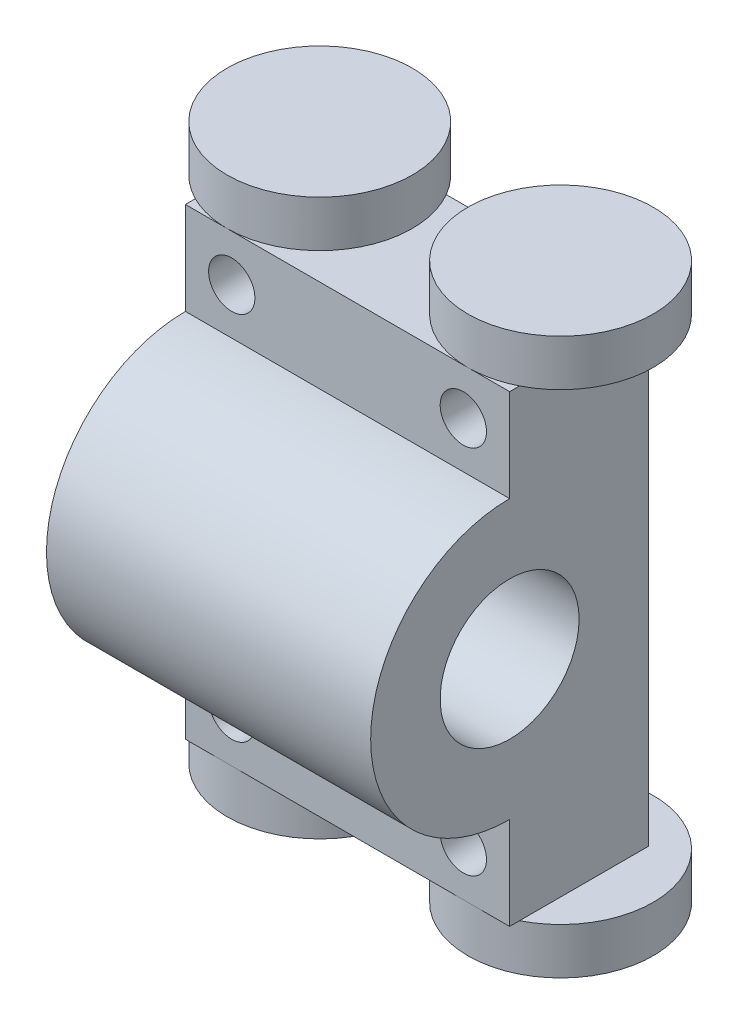
ISO-10303-21;
HEADER;
FILE_DESCRIPTION(('STEP AP214'),'2;1');
FILE_NAME('part.step','',(''),(''),'','','');
FILE_SCHEMA(('AUTOMOTIVE_DESIGN { 1 0 10303 214 1 1 1 1 }'));
ENDSEC;
DATA;
#1=APPLICATION_CONTEXT('core data for automotive mechanical design processes');
#2=APPLICATION_PROTOCOL_DEFINITION('international standard','automotive_design',2000,#1);
#3=PRODUCT_CONTEXT('',#1,'mechanical');
#4=PRODUCT('Part','Part','',(#3));
#5=PRODUCT_RELATED_PRODUCT_CATEGORY('part','',(#4));
#6=PRODUCT_DEFINITION_FORMATION('','',#4);
#7=PRODUCT_DEFINITION_CONTEXT('part definition',#1,'design');
#8=PRODUCT_DEFINITION('design','',#6,#7);
#9=PRODUCT_DEFINITION_SHAPE('','',#8);
#10=(LENGTH_UNIT() NAMED_UNIT(*) SI_UNIT(.MILLI.,.METRE.));
#11=(NAMED_UNIT(*) PLANE_ANGLE_UNIT() SI_UNIT($,.RADIAN.));
#12=(NAMED_UNIT(*) SI_UNIT($,.STERADIAN.) SOLID_ANGLE_UNIT());
#13=UNCERTAINTY_MEASURE_WITH_UNIT(LENGTH_MEASURE(1.E-05),#10,'distance_accuracy_value','');
#14=(GEOMETRIC_REPRESENTATION_CONTEXT(3) GLOBAL_UNCERTAINTY_ASSIGNED_CONTEXT((#13)) GLOBAL_UNIT_ASSIGNED_CONTEXT((#10,
#11,#12)) REPRESENTATION_CONTEXT('',''));
#15=CARTESIAN_POINT('',(0.,0.,0.));
#16=DIRECTION('',(0.,0.,1.));
#17=DIRECTION('',(1.,0.,0.));
#18=AXIS2_PLACEMENT_3D('',#15,#16,#17);
#19=CARTESIAN_POINT('',(35.,-25.,15.));
#20=DIRECTION('',(0.,1.,0.));
#21=DIRECTION('',(0.,0.,1.));
#22=AXIS2_PLACEMENT_3D('',#19,#20,#21);
#23=PLANE('',#22);
#24=DIRECTION('',(-1.,0.,0.));
#25=VECTOR('',#24,1.);
#26=CARTESIAN_POINT('',(35.,-25.,15.));
#27=LINE('',#26,#25);
#28=CARTESIAN_POINT('',(35.,-25.,15.));
#29=VERTEX_POINT('',#28);
#30=CARTESIAN_POINT('',(30.5,-25.,15.));
#31=VERTEX_POINT('',#30);
#32=EDGE_CURVE('E41',#29,#31,#27,.T.);
#33=ORIENTED_EDGE('',*,*,#32,.T.);
#34=CARTESIAN_POINT('',(30.5,-25.,5.));
#35=DIRECTION('',(0.,-1.,0.));
#36=DIRECTION('',(0.,0.,1.));
#37=AXIS2_PLACEMENT_3D('',#34,#35,#36);
#38=CIRCLE('',#37,10.);
#39=CARTESIAN_POINT('',(35.,-25.,13.9302855497459));
#40=VERTEX_POINT('',#39);
#41=EDGE_CURVE('E126',#40,#31,#38,.T.);
#42=ORIENTED_EDGE('',*,*,#41,.F.);
#43=DIRECTION('',(0.,0.,-1.));
#44=VECTOR('',#43,1.);
#45=CARTESIAN_POINT('',(35.,-25.,15.));
#46=LINE('',#45,#44);
#47=EDGE_CURVE('E150',#29,#40,#46,.T.);
#48=ORIENTED_EDGE('',*,*,#47,.F.);
#49=EDGE_LOOP('',(#33,#42,#48));
#50=FACE_BOUND('',#49,.T.);
#51=ADVANCED_FACE('F32',(#50),#23,.F.);
#52=CARTESIAN_POINT('',(35.,25.,15.));
#53=DIRECTION('',(0.,-1.,0.));
#54=DIRECTION('',(0.,0.,-1.));
#55=AXIS2_PLACEMENT_3D('',#52,#53,#54);
#56=PLANE('',#55);
#57=CARTESIAN_POINT('',(30.5,25.,5.));
#58=DIRECTION('',(0.,-1.,0.));
#59=DIRECTION('',(0.,0.,1.));
#60=AXIS2_PLACEMENT_3D('',#57,#58,#59);
#61=CIRCLE('',#60,10.);
#62=CARTESIAN_POINT('',(30.5,25.,15.));
#63=VERTEX_POINT('',#62);
#64=CARTESIAN_POINT('',(21.8397459621556,25.,0.));
#65=VERTEX_POINT('',#64);
#66=EDGE_CURVE('E225',#63,#65,#61,.T.);
#67=ORIENTED_EDGE('',*,*,#66,.T.);
#68=DIRECTION('',(-1.,0.,0.));
#69=VECTOR('',#68,1.);
#70=CARTESIAN_POINT('',(35.,25.,0.));
#71=LINE('',#70,#69);
#72=CARTESIAN_POINT('',(13.1602540378444,25.,0.));
#73=VERTEX_POINT('',#72);
#74=EDGE_CURVE('E160',#65,#73,#71,.T.);
#75=ORIENTED_EDGE('',*,*,#74,.T.);
#76=CARTESIAN_POINT('',(4.5,25.,5.));
#77=DIRECTION('',(0.,1.,0.));
#78=DIRECTION('',(0.,0.,1.));
#79=AXIS2_PLACEMENT_3D('',#76,#77,#78);
#80=CIRCLE('',#79,10.);
#81=CARTESIAN_POINT('',(4.5,25.,15.));
#82=VERTEX_POINT('',#81);
#83=EDGE_CURVE('E206',#82,#73,#80,.T.);
#84=ORIENTED_EDGE('',*,*,#83,.F.);
#85=DIRECTION('',(-1.,0.,0.));
#86=VECTOR('',#85,1.);
#87=CARTESIAN_POINT('',(35.,25.,15.));
#88=LINE('',#87,#86);
#89=EDGE_CURVE('E164',#63,#82,#88,.T.);
#90=ORIENTED_EDGE('',*,*,#89,.F.);
#91=EDGE_LOOP('',(#67,#75,#84,#90));
#92=FACE_BOUND('',#91,.T.);
#93=ADVANCED_FACE('F291',(#92),#56,.F.);
#94=CARTESIAN_POINT('',(4.5,-25.,5.));
#95=DIRECTION('',(0.,1.,0.));
#96=DIRECTION('',(0.,0.,1.));
#97=AXIS2_PLACEMENT_3D('',#94,#95,#96);
#98=CIRCLE('',#97,10.);
#99=CARTESIAN_POINT('',(0.,-25.,13.9302855497459));
#100=VERTEX_POINT('',#99);
#101=CARTESIAN_POINT('',(4.5,-25.,15.));
#102=VERTEX_POINT('',#101);
#103=EDGE_CURVE('E224',#100,#102,#98,.T.);
#104=ORIENTED_EDGE('',*,*,#103,.T.);
#105=CARTESIAN_POINT('',(0.,-25.,15.));
#106=VERTEX_POINT('',#105);
#107=EDGE_CURVE('E147',#102,#106,#27,.T.);
#108=ORIENTED_EDGE('',*,*,#107,.T.);
#109=DIRECTION('',(0.,0.,-1.));
#110=VECTOR('',#109,1.);
#111=CARTESIAN_POINT('',(0.,-25.,15.));
#112=LINE('',#111,#110);
#113=EDGE_CURVE('E179',#106,#100,#112,.T.);
#114=ORIENTED_EDGE('',*,*,#113,.T.);
#115=EDGE_LOOP('',(#104,#108,#114));
#116=FACE_BOUND('',#115,.T.);
#117=ADVANCED_FACE('F313',(#116),#23,.F.);
#118=CARTESIAN_POINT('',(35.,25.,13.9302855497459));
#119=VERTEX_POINT('',#118);
#120=EDGE_CURVE('E231',#119,#63,#61,.T.);
#121=ORIENTED_EDGE('',*,*,#120,.T.);
#122=CARTESIAN_POINT('',(35.,25.,15.));
#123=VERTEX_POINT('',#122);
#124=EDGE_CURVE('E161',#123,#63,#88,.T.);
#125=ORIENTED_EDGE('',*,*,#124,.F.);
#126=DIRECTION('',(0.,0.,1.));
#127=VECTOR('',#126,1.);
#128=CARTESIAN_POINT('',(35.,25.,15.));
#129=LINE('',#128,#127);
#130=EDGE_CURVE('E191',#119,#123,#129,.T.);
#131=ORIENTED_EDGE('',*,*,#130,.F.);
#132=EDGE_LOOP('',(#121,#125,#131));
#133=FACE_BOUND('',#132,.T.);
#134=ADVANCED_FACE('F288',(#133),#56,.F.);
#135=CARTESIAN_POINT('',(35.,0.,15.));
#136=DIRECTION('',(-1.,0.,0.));
#137=DIRECTION('',(0.,0.,1.));
#138=AXIS2_PLACEMENT_3D('',#135,#136,#137);
#139=CYLINDRICAL_SURFACE('',#138,15.);
#140=CARTESIAN_POINT('',(0.,0.,15.));
#141=DIRECTION('',(1.,0.,0.));
#142=DIRECTION('',(0.,0.,-1.));
#143=AXIS2_PLACEMENT_3D('',#140,#141,#142);
#144=CIRCLE('',#143,15.);
#145=CARTESIAN_POINT('',(0.,15.,15.));
#146=VERTEX_POINT('',#145);
#147=CARTESIAN_POINT('',(0.,-15.,15.));
#148=VERTEX_POINT('',#147);
#149=EDGE_CURVE('E183',#146,#148,#144,.T.);
#150=ORIENTED_EDGE('',*,*,#149,.T.);
#151=DIRECTION('',(-1.,0.,0.));
#152=VECTOR('',#151,1.);
#153=CARTESIAN_POINT('',(35.,-15.,15.));
#154=LINE('',#153,#152);
#155=CARTESIAN_POINT('',(35.,-15.,15.));
#156=VERTEX_POINT('',#155);
#157=EDGE_CURVE('E11',#156,#148,#154,.T.);
#158=ORIENTED_EDGE('',*,*,#157,.F.);
#159=CARTESIAN_POINT('',(35.,0.,15.));
#160=DIRECTION('',(1.,0.,0.));
#161=DIRECTION('',(0.,0.,-1.));
#162=AXIS2_PLACEMENT_3D('',#159,#160,#161);
#163=CIRCLE('',#162,15.);
#164=CARTESIAN_POINT('',(35.,15.,15.));
#165=VERTEX_POINT('',#164);
#166=EDGE_CURVE('E172',#165,#156,#163,.T.);
#167=ORIENTED_EDGE('',*,*,#166,.F.);
#168=DIRECTION('',(-1.,0.,0.));
#169=VECTOR('',#168,1.);
#170=CARTESIAN_POINT('',(35.,15.,15.));
#171=LINE('',#170,#169);
#172=EDGE_CURVE('E166',#165,#146,#171,.T.);
#173=ORIENTED_EDGE('',*,*,#172,.T.);
#174=EDGE_LOOP('',(#150,#158,#167,#173));
#175=FACE_BOUND('',#174,.T.);
#176=ADVANCED_FACE('F34',(#175),#139,.T.);
#177=CARTESIAN_POINT('',(35.,-15.,15.));
#178=DIRECTION('',(0.,0.,-1.));
#179=DIRECTION('',(0.,1.,0.));
#180=AXIS2_PLACEMENT_3D('',#177,#178,#179);
#181=PLANE('',#180);
#182=CARTESIAN_POINT('',(5.,-20.,15.));
#183=DIRECTION('',(0.,0.,1.));
#184=DIRECTION('',(-1.,0.,0.));
#185=AXIS2_PLACEMENT_3D('',#182,#183,#184);
#186=CIRCLE('',#185,2.5);
#187=CARTESIAN_POINT('',(2.5,-20.,15.));
#188=VERTEX_POINT('',#187);
#189=EDGE_CURVE('E249',#188,#188,#186,.T.);
#190=ORIENTED_EDGE('',*,*,#189,.F.);
#191=EDGE_LOOP('',(#190));
#192=FACE_BOUND('',#191,.T.);
#193=CARTESIAN_POINT('',(30.,-20.,15.));
#194=DIRECTION('',(0.,0.,1.));
#195=DIRECTION('',(1.,0.,0.));
#196=AXIS2_PLACEMENT_3D('',#193,#194,#195);
#197=CIRCLE('',#196,2.5);
#198=CARTESIAN_POINT('',(32.5,-20.,15.));
#199=VERTEX_POINT('',#198);
#200=EDGE_CURVE('E252',#199,#199,#197,.T.);
#201=ORIENTED_EDGE('',*,*,#200,.F.);
#202=EDGE_LOOP('',(#201));
#203=FACE_BOUND('',#202,.T.);
#204=DIRECTION('',(0.,-1.,0.));
#205=VECTOR('',#204,1.);
#206=CARTESIAN_POINT('',(0.,-15.,15.));
#207=LINE('',#206,#205);
#208=EDGE_CURVE('E181',#148,#106,#207,.T.);
#209=ORIENTED_EDGE('',*,*,#208,.T.);
#210=ORIENTED_EDGE('',*,*,#107,.F.);
#211=EDGE_CURVE('E57',#31,#102,#27,.T.);
#212=ORIENTED_EDGE('',*,*,#211,.F.);
#213=ORIENTED_EDGE('',*,*,#32,.F.);
#214=DIRECTION('',(0.,-1.,0.));
#215=VECTOR('',#214,1.);
#216=CARTESIAN_POINT('',(35.,-15.,15.));
#217=LINE('',#216,#215);
#218=EDGE_CURVE('E196',#156,#29,#217,.T.);
#219=ORIENTED_EDGE('',*,*,#218,.F.);
#220=ORIENTED_EDGE('',*,*,#157,.T.);
#221=EDGE_LOOP('',(#209,#210,#212,#213,#219,#220));
#222=FACE_BOUND('',#221,.T.);
#223=ADVANCED_FACE('F146',(#192,#203,#222),#181,.F.);
#224=DIRECTION('',(-1.,0.,0.));
#225=VECTOR('',#224,1.);
#226=CARTESIAN_POINT('',(35.,-25.,0.));
#227=LINE('',#226,#225);
#228=CARTESIAN_POINT('',(21.8397459621556,-25.,0.));
#229=VERTEX_POINT('',#228);
#230=CARTESIAN_POINT('',(13.1602540378444,-25.,0.));
#231=VERTEX_POINT('',#230);
#232=EDGE_CURVE('E139',#229,#231,#227,.T.);
#233=ORIENTED_EDGE('',*,*,#232,.F.);
#234=EDGE_CURVE('E129',#31,#229,#38,.T.);
#235=ORIENTED_EDGE('',*,*,#234,.F.);
#236=ORIENTED_EDGE('',*,*,#211,.T.);
#237=EDGE_CURVE('E220',#102,#231,#98,.T.);
#238=ORIENTED_EDGE('',*,*,#237,.T.);
#239=EDGE_LOOP('',(#233,#235,#236,#238));
#240=FACE_BOUND('',#239,.T.);
#241=ADVANCED_FACE('F138',(#240),#23,.F.);
#242=CARTESIAN_POINT('',(35.,25.,0.));
#243=DIRECTION('',(0.,0.,1.));
#244=DIRECTION('',(1.,0.,0.));
#245=AXIS2_PLACEMENT_3D('',#242,#243,#244);
#246=PLANE('',#245);
#247=CARTESIAN_POINT('',(5.,-20.,0.));
#248=DIRECTION('',(0.,0.,1.));
#249=DIRECTION('',(1.,0.,0.));
#250=AXIS2_PLACEMENT_3D('',#247,#248,#249);
#251=CIRCLE('',#250,2.5);
#252=CARTESIAN_POINT('',(7.5,-20.,0.));
#253=VERTEX_POINT('',#252);
#254=EDGE_CURVE('E36',#253,#253,#251,.T.);
#255=ORIENTED_EDGE('',*,*,#254,.T.);
#256=EDGE_LOOP('',(#255));
#257=FACE_BOUND('',#256,.T.);
#258=CARTESIAN_POINT('',(30.,-20.,0.));
#259=DIRECTION('',(0.,0.,1.));
#260=DIRECTION('',(1.,0.,0.));
#261=AXIS2_PLACEMENT_3D('',#258,#259,#260);
#262=CIRCLE('',#261,2.5);
#263=CARTESIAN_POINT('',(32.5,-20.,0.));
#264=VERTEX_POINT('',#263);
#265=EDGE_CURVE('E241',#264,#264,#262,.T.);
#266=ORIENTED_EDGE('',*,*,#265,.T.);
#267=EDGE_LOOP('',(#266));
#268=FACE_BOUND('',#267,.T.);
#269=CARTESIAN_POINT('',(30.,20.,0.));
#270=DIRECTION('',(0.,0.,1.));
#271=DIRECTION('',(1.,0.,0.));
#272=AXIS2_PLACEMENT_3D('',#269,#270,#271);
#273=CIRCLE('',#272,2.5);
#274=CARTESIAN_POINT('',(32.5,20.,0.));
#275=VERTEX_POINT('',#274);
#276=EDGE_CURVE('E238',#275,#275,#273,.T.);
#277=ORIENTED_EDGE('',*,*,#276,.T.);
#278=EDGE_LOOP('',(#277));
#279=FACE_BOUND('',#278,.T.);
#280=CARTESIAN_POINT('',(5.,20.,0.));
#281=DIRECTION('',(0.,0.,1.));
#282=DIRECTION('',(1.,0.,0.));
#283=AXIS2_PLACEMENT_3D('',#280,#281,#282);
#284=CIRCLE('',#283,2.5);
#285=CARTESIAN_POINT('',(7.5,20.,0.));
#286=VERTEX_POINT('',#285);
#287=EDGE_CURVE('E242',#286,#286,#284,.T.);
#288=ORIENTED_EDGE('',*,*,#287,.T.);
#289=EDGE_LOOP('',(#288));
#290=FACE_BOUND('',#289,.T.);
#291=DIRECTION('',(0.,1.,0.));
#292=VECTOR('',#291,1.);
#293=CARTESIAN_POINT('',(0.,25.,0.));
#294=LINE('',#293,#292);
#295=CARTESIAN_POINT('',(0.,-25.,0.));
#296=VERTEX_POINT('',#295);
#297=CARTESIAN_POINT('',(0.,25.,0.));
#298=VERTEX_POINT('',#297);
#299=EDGE_CURVE('E177',#296,#298,#294,.T.);
#300=ORIENTED_EDGE('',*,*,#299,.T.);
#301=DIRECTION('',(-1.,0.,0.));
#302=VECTOR('',#301,1.);
#303=CARTESIAN_POINT('',(35.,25.,0.));
#304=LINE('',#303,#302);
#305=EDGE_CURVE('E203',#73,#298,#304,.T.);
#306=ORIENTED_EDGE('',*,*,#305,.F.);
#307=ORIENTED_EDGE('',*,*,#74,.F.);
#308=CARTESIAN_POINT('',(35.,25.,0.));
#309=VERTEX_POINT('',#308);
#310=EDGE_CURVE('E157',#309,#65,#71,.T.);
#311=ORIENTED_EDGE('',*,*,#310,.F.);
#312=DIRECTION('',(0.,1.,0.));
#313=VECTOR('',#312,1.);
#314=CARTESIAN_POINT('',(35.,25.,0.));
#315=LINE('',#314,#313);
#316=CARTESIAN_POINT('',(35.,-25.,0.));
#317=VERTEX_POINT('',#316);
#318=EDGE_CURVE('E192',#317,#309,#315,.T.);
#319=ORIENTED_EDGE('',*,*,#318,.F.);
#320=EDGE_CURVE('E152',#317,#229,#227,.T.);
#321=ORIENTED_EDGE('',*,*,#320,.T.);
#322=ORIENTED_EDGE('',*,*,#232,.T.);
#323=DIRECTION('',(1.,0.,0.));
#324=VECTOR('',#323,1.);
#325=CARTESIAN_POINT('',(35.,-25.,0.));
#326=LINE('',#325,#324);
#327=EDGE_CURVE('E211',#296,#231,#326,.T.);
#328=ORIENTED_EDGE('',*,*,#327,.F.);
#329=EDGE_LOOP('',(#300,#306,#307,#311,#319,#321,#322,#328));
#330=FACE_BOUND('',#329,.T.);
#331=ADVANCED_FACE('F306',(#257,#268,#279,#290,#330),#246,.F.);
#332=CARTESIAN_POINT('',(0.,25.,15.));
#333=VERTEX_POINT('',#332);
#334=EDGE_CURVE('E165',#82,#333,#88,.T.);
#335=ORIENTED_EDGE('',*,*,#334,.F.);
#336=CARTESIAN_POINT('',(0.,25.,13.9302855497459));
#337=VERTEX_POINT('',#336);
#338=EDGE_CURVE('E210',#337,#82,#80,.T.);
#339=ORIENTED_EDGE('',*,*,#338,.F.);
#340=DIRECTION('',(0.,0.,1.));
#341=VECTOR('',#340,1.);
#342=CARTESIAN_POINT('',(0.,25.,15.));
#343=LINE('',#342,#341);
#344=EDGE_CURVE('E176',#337,#333,#343,.T.);
#345=ORIENTED_EDGE('',*,*,#344,.T.);
#346=EDGE_LOOP('',(#335,#339,#345));
#347=FACE_BOUND('',#346,.T.);
#348=ADVANCED_FACE('F265',(#347),#56,.F.);
#349=CARTESIAN_POINT('',(35.,25.,15.));
#350=DIRECTION('',(0.,0.,-1.));
#351=DIRECTION('',(0.,1.,0.));
#352=AXIS2_PLACEMENT_3D('',#349,#350,#351);
#353=PLANE('',#352);
#354=CARTESIAN_POINT('',(30.,20.,15.));
#355=DIRECTION('',(0.,0.,1.));
#356=DIRECTION('',(-1.,0.,0.));
#357=AXIS2_PLACEMENT_3D('',#354,#355,#356);
#358=CIRCLE('',#357,2.5);
#359=CARTESIAN_POINT('',(27.5,20.,15.));
#360=VERTEX_POINT('',#359);
#361=EDGE_CURVE('E248',#360,#360,#358,.T.);
#362=ORIENTED_EDGE('',*,*,#361,.F.);
#363=EDGE_LOOP('',(#362));
#364=FACE_BOUND('',#363,.T.);
#365=CARTESIAN_POINT('',(5.,20.,15.));
#366=DIRECTION('',(0.,0.,1.));
#367=DIRECTION('',(1.,0.,0.));
#368=AXIS2_PLACEMENT_3D('',#365,#366,#367);
#369=CIRCLE('',#368,2.5);
#370=CARTESIAN_POINT('',(7.5,20.,15.));
#371=VERTEX_POINT('',#370);
#372=EDGE_CURVE('E245',#371,#371,#369,.T.);
#373=ORIENTED_EDGE('',*,*,#372,.F.);
#374=EDGE_LOOP('',(#373));
#375=FACE_BOUND('',#374,.T.);
#376=DIRECTION('',(0.,-1.,0.));
#377=VECTOR('',#376,1.);
#378=CARTESIAN_POINT('',(0.,25.,15.));
#379=LINE('',#378,#377);
#380=EDGE_CURVE('E170',#333,#146,#379,.T.);
#381=ORIENTED_EDGE('',*,*,#380,.T.);
#382=ORIENTED_EDGE('',*,*,#172,.F.);
#383=DIRECTION('',(0.,-1.,0.));
#384=VECTOR('',#383,1.);
#385=CARTESIAN_POINT('',(35.,25.,15.));
#386=LINE('',#385,#384);
#387=EDGE_CURVE('E169',#123,#165,#386,.T.);
#388=ORIENTED_EDGE('',*,*,#387,.F.);
#389=ORIENTED_EDGE('',*,*,#124,.T.);
#390=ORIENTED_EDGE('',*,*,#89,.T.);
#391=ORIENTED_EDGE('',*,*,#334,.T.);
#392=EDGE_LOOP('',(#381,#382,#388,#389,#390,#391));
#393=FACE_BOUND('',#392,.T.);
#394=ADVANCED_FACE('F261',(#364,#375,#393),#353,.F.);
#395=CARTESIAN_POINT('',(35.,0.,15.));
#396=DIRECTION('',(1.,0.,0.));
#397=DIRECTION('',(0.,0.,-1.));
#398=AXIS2_PLACEMENT_3D('',#395,#396,#397);
#399=PLANE('',#398);
#400=CARTESIAN_POINT('',(35.,0.,15.));
#401=DIRECTION('',(1.,0.,0.));
#402=DIRECTION('',(0.,0.,-1.));
#403=AXIS2_PLACEMENT_3D('',#400,#401,#402);
#404=CIRCLE('',#403,7.5);
#405=CARTESIAN_POINT('',(35.,0.,7.5));
#406=VERTEX_POINT('',#405);
#407=EDGE_CURVE('E200',#406,#406,#404,.T.);
#408=ORIENTED_EDGE('',*,*,#407,.F.);
#409=EDGE_LOOP('',(#408));
#410=FACE_BOUND('',#409,.T.);
#411=ORIENTED_EDGE('',*,*,#166,.T.);
#412=ORIENTED_EDGE('',*,*,#218,.T.);
#413=ORIENTED_EDGE('',*,*,#47,.T.);
#414=DIRECTION('',(0.,0.,-1.));
#415=VECTOR('',#414,1.);
#416=CARTESIAN_POINT('',(35.,-25.,15.));
#417=LINE('',#416,#415);
#418=EDGE_CURVE('E141',#40,#317,#417,.T.);
#419=ORIENTED_EDGE('',*,*,#418,.T.);
#420=ORIENTED_EDGE('',*,*,#318,.T.);
#421=EDGE_CURVE('E188',#309,#119,#129,.T.);
#422=ORIENTED_EDGE('',*,*,#421,.T.);
#423=ORIENTED_EDGE('',*,*,#130,.T.);
#424=ORIENTED_EDGE('',*,*,#387,.T.);
#425=EDGE_LOOP('',(#411,#412,#413,#419,#420,#422,#423,#424));
#426=FACE_BOUND('',#425,.T.);
#427=ADVANCED_FACE('F264',(#410,#426),#399,.T.);
#428=CARTESIAN_POINT('',(0.,0.,15.));
#429=DIRECTION('',(1.,0.,0.));
#430=DIRECTION('',(0.,0.,-1.));
#431=AXIS2_PLACEMENT_3D('',#428,#429,#430);
#432=PLANE('',#431);
#433=CARTESIAN_POINT('',(0.,0.,15.));
#434=DIRECTION('',(1.,0.,0.));
#435=DIRECTION('',(0.,0.,-1.));
#436=AXIS2_PLACEMENT_3D('',#433,#434,#435);
#437=CIRCLE('',#436,7.5);
#438=CARTESIAN_POINT('',(0.,0.,7.5));
#439=VERTEX_POINT('',#438);
#440=EDGE_CURVE('E186',#439,#439,#437,.T.);
#441=ORIENTED_EDGE('',*,*,#440,.T.);
#442=EDGE_LOOP('',(#441));
#443=FACE_BOUND('',#442,.T.);
#444=ORIENTED_EDGE('',*,*,#149,.F.);
#445=ORIENTED_EDGE('',*,*,#380,.F.);
#446=ORIENTED_EDGE('',*,*,#344,.F.);
#447=EDGE_CURVE('E173',#298,#337,#343,.T.);
#448=ORIENTED_EDGE('',*,*,#447,.F.);
#449=ORIENTED_EDGE('',*,*,#299,.F.);
#450=DIRECTION('',(0.,0.,-1.));
#451=VECTOR('',#450,1.);
#452=CARTESIAN_POINT('',(0.,-25.,15.));
#453=LINE('',#452,#451);
#454=EDGE_CURVE('E217',#100,#296,#453,.T.);
#455=ORIENTED_EDGE('',*,*,#454,.F.);
#456=ORIENTED_EDGE('',*,*,#113,.F.);
#457=ORIENTED_EDGE('',*,*,#208,.F.);
#458=EDGE_LOOP('',(#444,#445,#446,#448,#449,#455,#456,#457));
#459=FACE_BOUND('',#458,.T.);
#460=ADVANCED_FACE('F279',(#443,#459),#432,.F.);
#461=CARTESIAN_POINT('',(-5.,0.,15.));
#462=DIRECTION('',(1.,0.,0.));
#463=DIRECTION('',(0.,0.,-1.));
#464=AXIS2_PLACEMENT_3D('',#461,#462,#463);
#465=CYLINDRICAL_SURFACE('',#464,7.5);
#466=ORIENTED_EDGE('',*,*,#407,.T.);
#467=EDGE_LOOP('',(#466));
#468=FACE_BOUND('',#467,.T.);
#469=ORIENTED_EDGE('',*,*,#440,.F.);
#470=EDGE_LOOP('',(#469));
#471=FACE_BOUND('',#470,.T.);
#472=ADVANCED_FACE('F367',(#468,#471),#465,.F.);
#473=CARTESIAN_POINT('',(4.5,25.,5.));
#474=DIRECTION('',(0.,1.,0.));
#475=DIRECTION('',(0.,0.,1.));
#476=AXIS2_PLACEMENT_3D('',#473,#474,#475);
#477=CYLINDRICAL_SURFACE('',#476,10.);
#478=ORIENTED_EDGE('',*,*,#83,.T.);
#479=EDGE_CURVE('E214',#73,#337,#80,.T.);
#480=ORIENTED_EDGE('',*,*,#479,.T.);
#481=ORIENTED_EDGE('',*,*,#338,.T.);
#482=EDGE_LOOP('',(#478,#480,#481));
#483=FACE_BOUND('',#482,.T.);
#484=CARTESIAN_POINT('',(4.5,30.,5.));
#485=DIRECTION('',(0.,1.,0.));
#486=DIRECTION('',(0.,0.,1.));
#487=AXIS2_PLACEMENT_3D('',#484,#485,#486);
#488=CIRCLE('',#487,10.);
#489=CARTESIAN_POINT('',(4.5,30.,15.));
#490=VERTEX_POINT('',#489);
#491=EDGE_CURVE('E207',#490,#490,#488,.T.);
#492=ORIENTED_EDGE('',*,*,#491,.F.);
#493=EDGE_LOOP('',(#492));
#494=FACE_BOUND('',#493,.T.);
#495=ADVANCED_FACE('F299',(#483,#494),#477,.T.);
#496=CARTESIAN_POINT('',(4.5,25.,5.));
#497=DIRECTION('',(0.,1.,0.));
#498=DIRECTION('',(0.,0.,1.));
#499=AXIS2_PLACEMENT_3D('',#496,#497,#498);
#500=PLANE('',#499);
#501=ORIENTED_EDGE('',*,*,#479,.F.);
#502=ORIENTED_EDGE('',*,*,#305,.T.);
#503=ORIENTED_EDGE('',*,*,#447,.T.);
#504=EDGE_LOOP('',(#501,#502,#503));
#505=FACE_BOUND('',#504,.T.);
#506=ADVANCED_FACE('F303',(#505),#500,.F.);
#507=CARTESIAN_POINT('',(4.5,30.,5.));
#508=DIRECTION('',(0.,1.,0.));
#509=DIRECTION('',(0.,0.,1.));
#510=AXIS2_PLACEMENT_3D('',#507,#508,#509);
#511=PLANE('',#510);
#512=ORIENTED_EDGE('',*,*,#491,.T.);
#513=EDGE_LOOP('',(#512));
#514=FACE_BOUND('',#513,.T.);
#515=ADVANCED_FACE('F379',(#514),#511,.T.);
#516=CARTESIAN_POINT('',(4.5,-25.,5.));
#517=DIRECTION('',(0.,-1.,0.));
#518=DIRECTION('',(0.,0.,1.));
#519=AXIS2_PLACEMENT_3D('',#516,#517,#518);
#520=PLANE('',#519);
#521=ORIENTED_EDGE('',*,*,#454,.T.);
#522=ORIENTED_EDGE('',*,*,#327,.T.);
#523=EDGE_CURVE('E227',#231,#100,#98,.T.);
#524=ORIENTED_EDGE('',*,*,#523,.T.);
#525=EDGE_LOOP('',(#521,#522,#524));
#526=FACE_BOUND('',#525,.T.);
#527=ADVANCED_FACE('F310',(#526),#520,.F.);
#528=CARTESIAN_POINT('',(4.5,-25.,5.));
#529=DIRECTION('',(0.,-1.,0.));
#530=DIRECTION('',(0.,0.,-1.));
#531=AXIS2_PLACEMENT_3D('',#528,#529,#530);
#532=CYLINDRICAL_SURFACE('',#531,10.);
#533=ORIENTED_EDGE('',*,*,#237,.F.);
#534=ORIENTED_EDGE('',*,*,#103,.F.);
#535=ORIENTED_EDGE('',*,*,#523,.F.);
#536=EDGE_LOOP('',(#533,#534,#535));
#537=FACE_BOUND('',#536,.T.);
#538=CARTESIAN_POINT('',(4.5,-30.,5.));
#539=DIRECTION('',(0.,1.,0.));
#540=DIRECTION('',(0.,0.,1.));
#541=AXIS2_PLACEMENT_3D('',#538,#539,#540);
#542=CIRCLE('',#541,10.);
#543=CARTESIAN_POINT('',(4.5,-30.,15.));
#544=VERTEX_POINT('',#543);
#545=EDGE_CURVE('E221',#544,#544,#542,.T.);
#546=ORIENTED_EDGE('',*,*,#545,.T.);
#547=EDGE_LOOP('',(#546));
#548=FACE_BOUND('',#547,.T.);
#549=ADVANCED_FACE('F314',(#537,#548),#532,.T.);
#550=CARTESIAN_POINT('',(4.5,-30.,5.));
#551=DIRECTION('',(0.,-1.,0.));
#552=DIRECTION('',(0.,0.,1.));
#553=AXIS2_PLACEMENT_3D('',#550,#551,#552);
#554=PLANE('',#553);
#555=ORIENTED_EDGE('',*,*,#545,.F.);
#556=EDGE_LOOP('',(#555));
#557=FACE_BOUND('',#556,.T.);
#558=ADVANCED_FACE('F317',(#557),#554,.T.);
#559=CARTESIAN_POINT('',(30.5,25.,5.));
#560=DIRECTION('',(0.,1.,0.));
#561=DIRECTION('',(0.,0.,1.));
#562=AXIS2_PLACEMENT_3D('',#559,#560,#561);
#563=CYLINDRICAL_SURFACE('',#562,10.);
#564=ORIENTED_EDGE('',*,*,#66,.F.);
#565=ORIENTED_EDGE('',*,*,#120,.F.);
#566=EDGE_CURVE('E49',#65,#119,#61,.T.);
#567=ORIENTED_EDGE('',*,*,#566,.F.);
#568=EDGE_LOOP('',(#564,#565,#567));
#569=FACE_BOUND('',#568,.T.);
#570=CARTESIAN_POINT('',(30.5,30.,5.));
#571=DIRECTION('',(0.,-1.,0.));
#572=DIRECTION('',(0.,0.,1.));
#573=AXIS2_PLACEMENT_3D('',#570,#571,#572);
#574=CIRCLE('',#573,10.);
#575=CARTESIAN_POINT('',(30.5,30.,15.));
#576=VERTEX_POINT('',#575);
#577=EDGE_CURVE('E228',#576,#576,#574,.T.);
#578=ORIENTED_EDGE('',*,*,#577,.T.);
#579=EDGE_LOOP('',(#578));
#580=FACE_BOUND('',#579,.T.);
#581=ADVANCED_FACE('F322',(#569,#580),#563,.T.);
#582=CARTESIAN_POINT('',(30.5,25.,5.));
#583=DIRECTION('',(0.,1.,0.));
#584=DIRECTION('',(0.,0.,1.));
#585=AXIS2_PLACEMENT_3D('',#582,#583,#584);
#586=PLANE('',#585);
#587=ORIENTED_EDGE('',*,*,#421,.F.);
#588=ORIENTED_EDGE('',*,*,#310,.T.);
#589=ORIENTED_EDGE('',*,*,#566,.T.);
#590=EDGE_LOOP('',(#587,#588,#589));
#591=FACE_BOUND('',#590,.T.);
#592=ADVANCED_FACE('F327',(#591),#586,.F.);
#593=CARTESIAN_POINT('',(30.5,30.,5.));
#594=DIRECTION('',(0.,1.,0.));
#595=DIRECTION('',(0.,0.,1.));
#596=AXIS2_PLACEMENT_3D('',#593,#594,#595);
#597=PLANE('',#596);
#598=ORIENTED_EDGE('',*,*,#577,.F.);
#599=EDGE_LOOP('',(#598));
#600=FACE_BOUND('',#599,.T.);
#601=ADVANCED_FACE('F485',(#600),#597,.T.);
#602=CARTESIAN_POINT('',(30.5,-25.,5.));
#603=DIRECTION('',(0.,-1.,0.));
#604=DIRECTION('',(0.,0.,1.));
#605=AXIS2_PLACEMENT_3D('',#602,#603,#604);
#606=PLANE('',#605);
#607=EDGE_CURVE('E131',#229,#40,#38,.T.);
#608=ORIENTED_EDGE('',*,*,#607,.F.);
#609=ORIENTED_EDGE('',*,*,#320,.F.);
#610=ORIENTED_EDGE('',*,*,#418,.F.);
#611=EDGE_LOOP('',(#608,#609,#610));
#612=FACE_BOUND('',#611,.T.);
#613=ADVANCED_FACE('F493',(#612),#606,.F.);
#614=CARTESIAN_POINT('',(30.5,-25.,5.));
#615=DIRECTION('',(0.,-1.,0.));
#616=DIRECTION('',(0.,0.,-1.));
#617=AXIS2_PLACEMENT_3D('',#614,#615,#616);
#618=CYLINDRICAL_SURFACE('',#617,10.);
#619=ORIENTED_EDGE('',*,*,#234,.T.);
#620=ORIENTED_EDGE('',*,*,#607,.T.);
#621=ORIENTED_EDGE('',*,*,#41,.T.);
#622=EDGE_LOOP('',(#619,#620,#621));
#623=FACE_BOUND('',#622,.T.);
#624=CARTESIAN_POINT('',(30.5,-30.,5.));
#625=DIRECTION('',(0.,-1.,0.));
#626=DIRECTION('',(0.,0.,1.));
#627=AXIS2_PLACEMENT_3D('',#624,#625,#626);
#628=CIRCLE('',#627,10.);
#629=CARTESIAN_POINT('',(30.5,-30.,15.));
#630=VERTEX_POINT('',#629);
#631=EDGE_CURVE('E136',#630,#630,#628,.T.);
#632=ORIENTED_EDGE('',*,*,#631,.F.);
#633=EDGE_LOOP('',(#632));
#634=FACE_BOUND('',#633,.T.);
#635=ADVANCED_FACE('F127',(#623,#634),#618,.T.);
#636=CARTESIAN_POINT('',(30.5,-30.,5.));
#637=DIRECTION('',(0.,-1.,0.));
#638=DIRECTION('',(0.,0.,1.));
#639=AXIS2_PLACEMENT_3D('',#636,#637,#638);
#640=PLANE('',#639);
#641=ORIENTED_EDGE('',*,*,#631,.T.);
#642=EDGE_LOOP('',(#641));
#643=FACE_BOUND('',#642,.T.);
#644=ADVANCED_FACE('F512',(#643),#640,.T.);
#645=CARTESIAN_POINT('',(5.,20.,-5.));
#646=DIRECTION('',(0.,0.,1.));
#647=DIRECTION('',(1.,0.,0.));
#648=AXIS2_PLACEMENT_3D('',#645,#646,#647);
#649=CYLINDRICAL_SURFACE('',#648,2.5);
#650=ORIENTED_EDGE('',*,*,#372,.T.);
#651=EDGE_LOOP('',(#650));
#652=FACE_BOUND('',#651,.T.);
#653=ORIENTED_EDGE('',*,*,#287,.F.);
#654=EDGE_LOOP('',(#653));
#655=FACE_BOUND('',#654,.T.);
#656=ADVANCED_FACE('F520',(#652,#655),#649,.F.);
#657=CARTESIAN_POINT('',(30.,20.,-5.));
#658=DIRECTION('',(0.,0.,1.));
#659=DIRECTION('',(1.,0.,0.));
#660=AXIS2_PLACEMENT_3D('',#657,#658,#659);
#661=CYLINDRICAL_SURFACE('',#660,2.5);
#662=ORIENTED_EDGE('',*,*,#361,.T.);
#663=EDGE_LOOP('',(#662));
#664=FACE_BOUND('',#663,.T.);
#665=ORIENTED_EDGE('',*,*,#276,.F.);
#666=EDGE_LOOP('',(#665));
#667=FACE_BOUND('',#666,.T.);
#668=ADVANCED_FACE('F258',(#664,#667),#661,.F.);
#669=CARTESIAN_POINT('',(30.,-20.,-5.));
#670=DIRECTION('',(0.,0.,1.));
#671=DIRECTION('',(1.,0.,0.));
#672=AXIS2_PLACEMENT_3D('',#669,#670,#671);
#673=CYLINDRICAL_SURFACE('',#672,2.5);
#674=ORIENTED_EDGE('',*,*,#200,.T.);
#675=EDGE_LOOP('',(#674));
#676=FACE_BOUND('',#675,.T.);
#677=ORIENTED_EDGE('',*,*,#265,.F.);
#678=EDGE_LOOP('',(#677));
#679=FACE_BOUND('',#678,.T.);
#680=ADVANCED_FACE('F353',(#676,#679),#673,.F.);
#681=CARTESIAN_POINT('',(5.,-20.,-5.));
#682=DIRECTION('',(0.,0.,1.));
#683=DIRECTION('',(1.,0.,0.));
#684=AXIS2_PLACEMENT_3D('',#681,#682,#683);
#685=CYLINDRICAL_SURFACE('',#684,2.5);
#686=ORIENTED_EDGE('',*,*,#189,.T.);
#687=EDGE_LOOP('',(#686));
#688=FACE_BOUND('',#687,.T.);
#689=ORIENTED_EDGE('',*,*,#254,.F.);
#690=EDGE_LOOP('',(#689));
#691=FACE_BOUND('',#690,.T.);
#692=ADVANCED_FACE('F356',(#688,#691),#685,.F.);
#693=CLOSED_SHELL('',(#51,#93,#117,#134,#176,#223,#241,#331,#348,#394,#427,#460,#472,#495,#506,
#515,#527,#549,#558,#581,#592,#601,#613,#635,#644,#656,#668,#680,#692));
#694=MANIFOLD_SOLID_BREP('B2',#693);
#695=ADVANCED_BREP_SHAPE_REPRESENTATION('',(#18,#694),#14);
#696=SHAPE_DEFINITION_REPRESENTATION(#9,#695);
ENDSEC;
END-ISO-10303-21;
